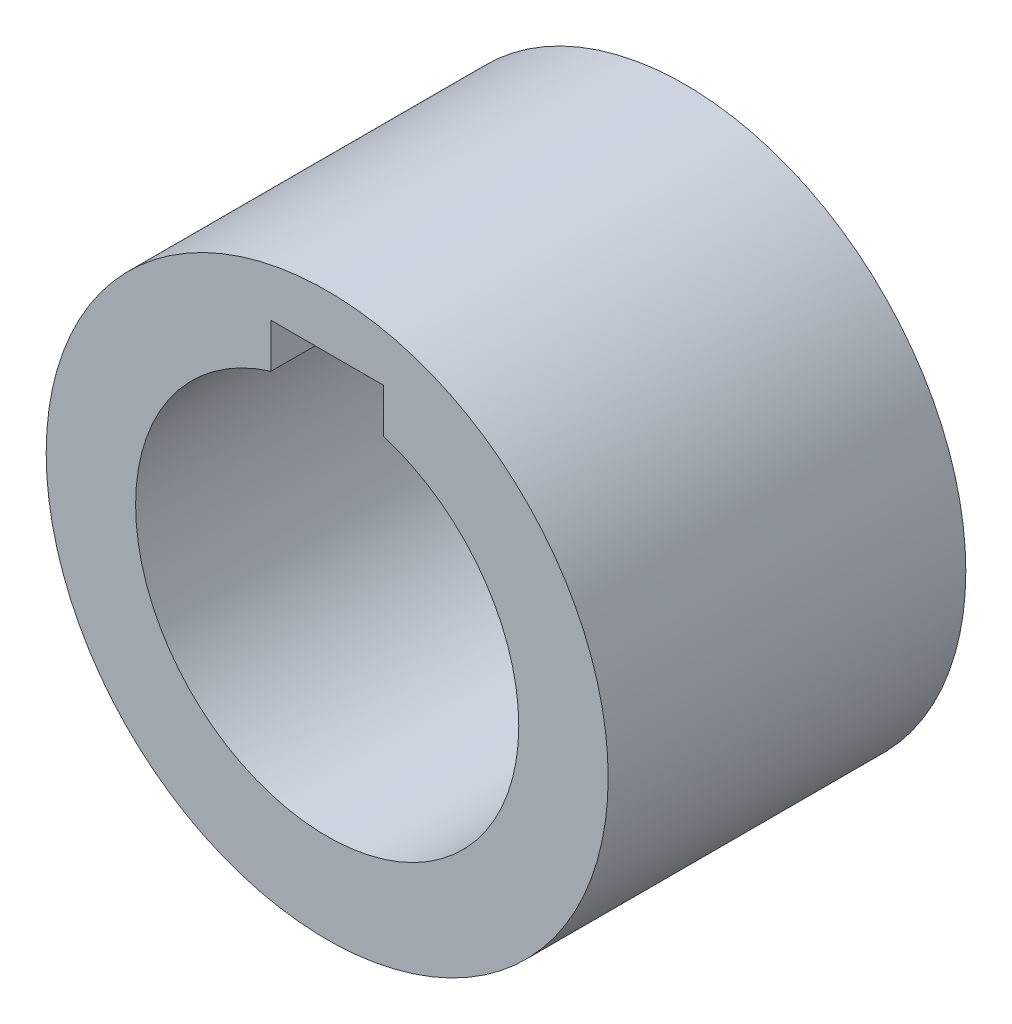
ISO-10303-21;
HEADER;
FILE_DESCRIPTION(('STEP AP214'),'2;1');
FILE_NAME('part.step','',(''),(''),'','','');
FILE_SCHEMA(('AUTOMOTIVE_DESIGN { 1 0 10303 214 1 1 1 1 }'));
ENDSEC;
DATA;
#1=APPLICATION_CONTEXT('core data for automotive mechanical design processes');
#2=APPLICATION_PROTOCOL_DEFINITION('international standard','automotive_design',2000,#1);
#3=PRODUCT_CONTEXT('',#1,'mechanical');
#4=PRODUCT('Part','Part','',(#3));
#5=PRODUCT_RELATED_PRODUCT_CATEGORY('part','',(#4));
#6=PRODUCT_DEFINITION_FORMATION('','',#4);
#7=PRODUCT_DEFINITION_CONTEXT('part definition',#1,'design');
#8=PRODUCT_DEFINITION('design','',#6,#7);
#9=PRODUCT_DEFINITION_SHAPE('','',#8);
#10=(LENGTH_UNIT() NAMED_UNIT(*) SI_UNIT(.MILLI.,.METRE.));
#11=(NAMED_UNIT(*) PLANE_ANGLE_UNIT() SI_UNIT($,.RADIAN.));
#12=(NAMED_UNIT(*) SI_UNIT($,.STERADIAN.) SOLID_ANGLE_UNIT());
#13=UNCERTAINTY_MEASURE_WITH_UNIT(LENGTH_MEASURE(1.E-05),#10,'distance_accuracy_value','');
#14=(GEOMETRIC_REPRESENTATION_CONTEXT(3) GLOBAL_UNCERTAINTY_ASSIGNED_CONTEXT((#13)) GLOBAL_UNIT_ASSIGNED_CONTEXT((#10,
#11,#12)) REPRESENTATION_CONTEXT('',''));
#15=CARTESIAN_POINT('',(0.,0.,0.));
#16=DIRECTION('',(0.,0.,1.));
#17=DIRECTION('',(1.,0.,0.));
#18=AXIS2_PLACEMENT_3D('',#15,#16,#17);
#19=CARTESIAN_POINT('',(0.,0.,70.));
#20=DIRECTION('',(0.,0.,1.));
#21=DIRECTION('',(1.,0.,0.));
#22=AXIS2_PLACEMENT_3D('',#19,#20,#21);
#23=PLANE('',#22);
#24=DIRECTION('',(0.,1.,0.));
#25=VECTOR('',#24,1.);
#26=CARTESIAN_POINT('',(11.,0.,70.));
#27=LINE('',#26,#25);
#28=CARTESIAN_POINT('',(11.,35.8503835404867,70.));
#29=VERTEX_POINT('',#28);
#30=CARTESIAN_POINT('',(11.,44.5,70.));
#31=VERTEX_POINT('',#30);
#32=EDGE_CURVE('E76',#29,#31,#27,.T.);
#33=ORIENTED_EDGE('',*,*,#32,.F.);
#34=CARTESIAN_POINT('',(0.,0.,70.));
#35=DIRECTION('',(0.,0.,1.));
#36=DIRECTION('',(1.,0.,0.));
#37=AXIS2_PLACEMENT_3D('',#34,#35,#36);
#38=CIRCLE('',#37,37.5);
#39=CARTESIAN_POINT('',(-11.,35.8503835404867,70.));
#40=VERTEX_POINT('',#39);
#41=EDGE_CURVE('E102',#40,#29,#38,.T.);
#42=ORIENTED_EDGE('',*,*,#41,.F.);
#43=DIRECTION('',(0.,-1.,0.));
#44=VECTOR('',#43,1.);
#45=CARTESIAN_POINT('',(-11.,0.,70.));
#46=LINE('',#45,#44);
#47=CARTESIAN_POINT('',(-11.,44.5,70.));
#48=VERTEX_POINT('',#47);
#49=EDGE_CURVE('E48',#48,#40,#46,.T.);
#50=ORIENTED_EDGE('',*,*,#49,.F.);
#51=DIRECTION('',(-1.,0.,0.));
#52=VECTOR('',#51,1.);
#53=CARTESIAN_POINT('',(0.,44.5,70.));
#54=LINE('',#53,#52);
#55=EDGE_CURVE('E100',#31,#48,#54,.T.);
#56=ORIENTED_EDGE('',*,*,#55,.F.);
#57=EDGE_LOOP('',(#33,#42,#50,#56));
#58=FACE_BOUND('',#57,.T.);
#59=CARTESIAN_POINT('',(0.,0.,70.));
#60=DIRECTION('',(0.,0.,1.));
#61=DIRECTION('',(1.,0.,0.));
#62=AXIS2_PLACEMENT_3D('',#59,#60,#61);
#63=CIRCLE('',#62,55.);
#64=CARTESIAN_POINT('',(55.,0.,70.));
#65=VERTEX_POINT('',#64);
#66=EDGE_CURVE('E107',#65,#65,#63,.T.);
#67=ORIENTED_EDGE('',*,*,#66,.T.);
#68=EDGE_LOOP('',(#67));
#69=FACE_BOUND('',#68,.T.);
#70=ADVANCED_FACE('F33',(#58,#69),#23,.T.);
#71=CARTESIAN_POINT('',(0.,0.,0.));
#72=DIRECTION('',(0.,0.,1.));
#73=DIRECTION('',(1.,0.,0.));
#74=AXIS2_PLACEMENT_3D('',#71,#72,#73);
#75=PLANE('',#74);
#76=CARTESIAN_POINT('',(0.,0.,0.));
#77=DIRECTION('',(0.,0.,1.));
#78=DIRECTION('',(1.,0.,0.));
#79=AXIS2_PLACEMENT_3D('',#76,#77,#78);
#80=CIRCLE('',#79,37.5);
#81=CARTESIAN_POINT('',(-11.,35.8503835404867,0.));
#82=VERTEX_POINT('',#81);
#83=CARTESIAN_POINT('',(11.,35.8503835404867,0.));
#84=VERTEX_POINT('',#83);
#85=EDGE_CURVE('E93',#82,#84,#80,.T.);
#86=ORIENTED_EDGE('',*,*,#85,.T.);
#87=DIRECTION('',(0.,1.,0.));
#88=VECTOR('',#87,1.);
#89=CARTESIAN_POINT('',(11.,30.5,0.));
#90=LINE('',#89,#88);
#91=CARTESIAN_POINT('',(11.,44.5,0.));
#92=VERTEX_POINT('',#91);
#93=EDGE_CURVE('E75',#84,#92,#90,.T.);
#94=ORIENTED_EDGE('',*,*,#93,.T.);
#95=DIRECTION('',(-1.,0.,0.));
#96=VECTOR('',#95,1.);
#97=CARTESIAN_POINT('',(-11.,44.5,0.));
#98=LINE('',#97,#96);
#99=CARTESIAN_POINT('',(-11.,44.5,0.));
#100=VERTEX_POINT('',#99);
#101=EDGE_CURVE('E83',#92,#100,#98,.T.);
#102=ORIENTED_EDGE('',*,*,#101,.T.);
#103=DIRECTION('',(0.,-1.,0.));
#104=VECTOR('',#103,1.);
#105=CARTESIAN_POINT('',(-11.,30.5,0.));
#106=LINE('',#105,#104);
#107=EDGE_CURVE('E80',#100,#82,#106,.T.);
#108=ORIENTED_EDGE('',*,*,#107,.T.);
#109=EDGE_LOOP('',(#86,#94,#102,#108));
#110=FACE_BOUND('',#109,.T.);
#111=CARTESIAN_POINT('',(0.,0.,0.));
#112=DIRECTION('',(0.,0.,1.));
#113=DIRECTION('',(1.,0.,0.));
#114=AXIS2_PLACEMENT_3D('',#111,#112,#113);
#115=CIRCLE('',#114,55.);
#116=CARTESIAN_POINT('',(55.,0.,0.));
#117=VERTEX_POINT('',#116);
#118=EDGE_CURVE('E105',#117,#117,#115,.T.);
#119=ORIENTED_EDGE('',*,*,#118,.F.);
#120=EDGE_LOOP('',(#119));
#121=FACE_BOUND('',#120,.T.);
#122=ADVANCED_FACE('F90',(#110,#121),#75,.F.);
#123=CARTESIAN_POINT('',(0.,0.,70.));
#124=DIRECTION('',(0.,0.,-1.));
#125=DIRECTION('',(-1.,0.,0.));
#126=AXIS2_PLACEMENT_3D('',#123,#124,#125);
#127=CYLINDRICAL_SURFACE('',#126,55.);
#128=ORIENTED_EDGE('',*,*,#66,.F.);
#129=EDGE_LOOP('',(#128));
#130=FACE_BOUND('',#129,.T.);
#131=ORIENTED_EDGE('',*,*,#118,.T.);
#132=EDGE_LOOP('',(#131));
#133=FACE_BOUND('',#132,.T.);
#134=ADVANCED_FACE('F35',(#130,#133),#127,.T.);
#135=CARTESIAN_POINT('',(0.,0.,70.));
#136=DIRECTION('',(0.,0.,-1.));
#137=DIRECTION('',(-1.,0.,0.));
#138=AXIS2_PLACEMENT_3D('',#135,#136,#137);
#139=CYLINDRICAL_SURFACE('',#138,37.5);
#140=DIRECTION('',(0.,0.,-1.));
#141=VECTOR('',#140,1.);
#142=CARTESIAN_POINT('',(11.,35.8503835404867,70.));
#143=LINE('',#142,#141);
#144=EDGE_CURVE('E11',#84,#29,#143,.F.);
#145=ORIENTED_EDGE('',*,*,#144,.F.);
#146=ORIENTED_EDGE('',*,*,#85,.F.);
#147=DIRECTION('',(0.,0.,-1.));
#148=VECTOR('',#147,1.);
#149=CARTESIAN_POINT('',(-11.,35.8503835404867,70.));
#150=LINE('',#149,#148);
#151=EDGE_CURVE('E41',#40,#82,#150,.T.);
#152=ORIENTED_EDGE('',*,*,#151,.F.);
#153=ORIENTED_EDGE('',*,*,#41,.T.);
#154=EDGE_LOOP('',(#145,#146,#152,#153));
#155=FACE_BOUND('',#154,.T.);
#156=ADVANCED_FACE('F114',(#155),#139,.F.);
#157=CARTESIAN_POINT('',(11.,30.5,0.));
#158=DIRECTION('',(1.,0.,0.));
#159=DIRECTION('',(0.,0.,-1.));
#160=AXIS2_PLACEMENT_3D('',#157,#158,#159);
#161=PLANE('',#160);
#162=ORIENTED_EDGE('',*,*,#32,.T.);
#163=DIRECTION('',(0.,0.,1.));
#164=VECTOR('',#163,1.);
#165=CARTESIAN_POINT('',(11.,44.5,0.));
#166=LINE('',#165,#164);
#167=EDGE_CURVE('E71',#92,#31,#166,.T.);
#168=ORIENTED_EDGE('',*,*,#167,.F.);
#169=ORIENTED_EDGE('',*,*,#93,.F.);
#170=ORIENTED_EDGE('',*,*,#144,.T.);
#171=EDGE_LOOP('',(#162,#168,#169,#170));
#172=FACE_BOUND('',#171,.T.);
#173=ADVANCED_FACE('F73',(#172),#161,.F.);
#174=CARTESIAN_POINT('',(-11.,30.5,0.));
#175=DIRECTION('',(-1.,0.,0.));
#176=DIRECTION('',(0.,0.,1.));
#177=AXIS2_PLACEMENT_3D('',#174,#175,#176);
#178=PLANE('',#177);
#179=ORIENTED_EDGE('',*,*,#49,.T.);
#180=ORIENTED_EDGE('',*,*,#151,.T.);
#181=ORIENTED_EDGE('',*,*,#107,.F.);
#182=DIRECTION('',(0.,0.,1.));
#183=VECTOR('',#182,1.);
#184=CARTESIAN_POINT('',(-11.,44.5,0.));
#185=LINE('',#184,#183);
#186=EDGE_CURVE('E79',#100,#48,#185,.T.);
#187=ORIENTED_EDGE('',*,*,#186,.T.);
#188=EDGE_LOOP('',(#179,#180,#181,#187));
#189=FACE_BOUND('',#188,.T.);
#190=ADVANCED_FACE('F111',(#189),#178,.F.);
#191=CARTESIAN_POINT('',(-11.,44.5,0.));
#192=DIRECTION('',(0.,1.,0.));
#193=DIRECTION('',(0.,0.,1.));
#194=AXIS2_PLACEMENT_3D('',#191,#192,#193);
#195=PLANE('',#194);
#196=ORIENTED_EDGE('',*,*,#55,.T.);
#197=ORIENTED_EDGE('',*,*,#186,.F.);
#198=ORIENTED_EDGE('',*,*,#101,.F.);
#199=ORIENTED_EDGE('',*,*,#167,.T.);
#200=EDGE_LOOP('',(#196,#197,#198,#199));
#201=FACE_BOUND('',#200,.T.);
#202=ADVANCED_FACE('F84',(#201),#195,.F.);
#203=CLOSED_SHELL('',(#70,#122,#134,#156,#173,#190,#202));
#204=MANIFOLD_SOLID_BREP('B2',#203);
#205=ADVANCED_BREP_SHAPE_REPRESENTATION('',(#18,#204),#14);
#206=SHAPE_DEFINITION_REPRESENTATION(#9,#205);
ENDSEC;
END-ISO-10303-21;
